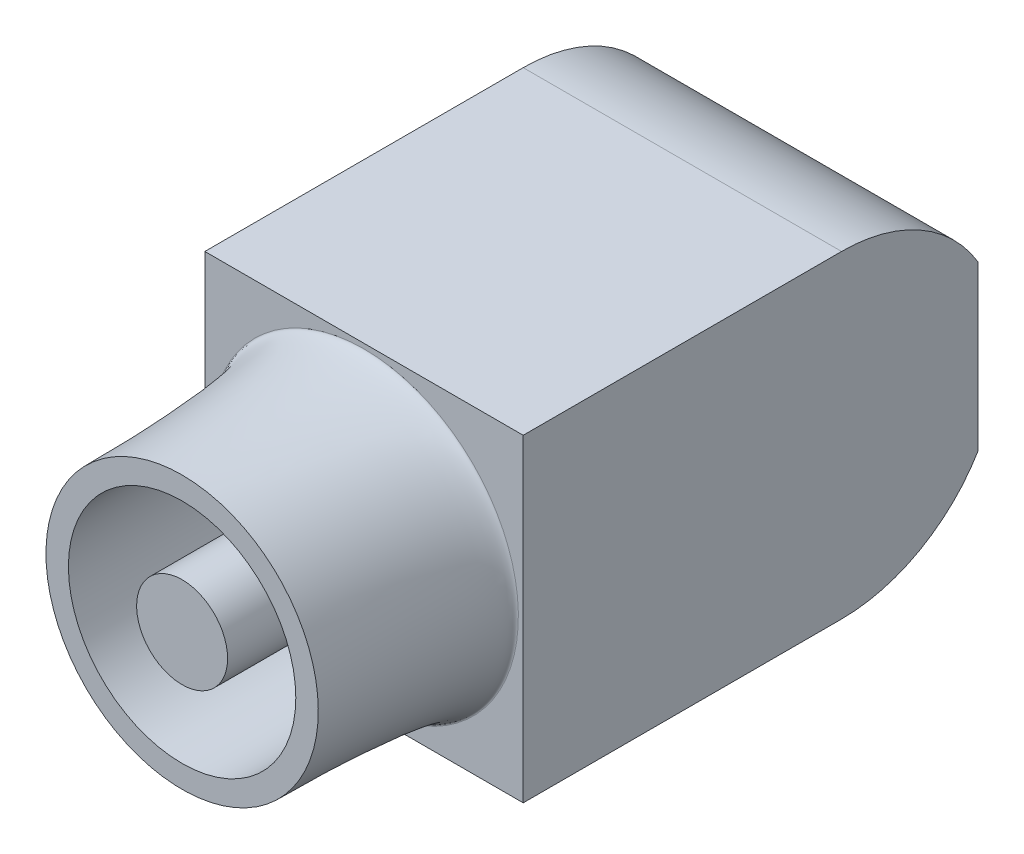
ISO-10303-21;
HEADER;
FILE_DESCRIPTION(('STEP AP214'),'2;1');
FILE_NAME('part.step','',(''),(''),'','','');
FILE_SCHEMA(('AUTOMOTIVE_DESIGN { 1 0 10303 214 1 1 1 1 }'));
ENDSEC;
DATA;
#1=APPLICATION_CONTEXT('core data for automotive mechanical design processes');
#2=APPLICATION_PROTOCOL_DEFINITION('international standard','automotive_design',2000,#1);
#3=PRODUCT_CONTEXT('',#1,'mechanical');
#4=PRODUCT('Part','Part','',(#3));
#5=PRODUCT_RELATED_PRODUCT_CATEGORY('part','',(#4));
#6=PRODUCT_DEFINITION_FORMATION('','',#4);
#7=PRODUCT_DEFINITION_CONTEXT('part definition',#1,'design');
#8=PRODUCT_DEFINITION('design','',#6,#7);
#9=PRODUCT_DEFINITION_SHAPE('','',#8);
#10=(LENGTH_UNIT() NAMED_UNIT(*) SI_UNIT(.MILLI.,.METRE.));
#11=(NAMED_UNIT(*) PLANE_ANGLE_UNIT() SI_UNIT($,.RADIAN.));
#12=(NAMED_UNIT(*) SI_UNIT($,.STERADIAN.) SOLID_ANGLE_UNIT());
#13=UNCERTAINTY_MEASURE_WITH_UNIT(LENGTH_MEASURE(1.E-05),#10,'distance_accuracy_value','');
#14=(GEOMETRIC_REPRESENTATION_CONTEXT(3) GLOBAL_UNCERTAINTY_ASSIGNED_CONTEXT((#13)) GLOBAL_UNIT_ASSIGNED_CONTEXT((#10,
#11,#12)) REPRESENTATION_CONTEXT('',''));
#15=CARTESIAN_POINT('',(0.,0.,0.));
#16=DIRECTION('',(0.,0.,1.));
#17=DIRECTION('',(1.,0.,0.));
#18=AXIS2_PLACEMENT_3D('',#15,#16,#17);
#19=CARTESIAN_POINT('',(35.,0.,-15.));
#20=DIRECTION('',(0.,0.,-1.));
#21=DIRECTION('',(0.,1.,0.));
#22=AXIS2_PLACEMENT_3D('',#19,#20,#21);
#23=PLANE('',#22);
#24=DIRECTION('',(0.,-1.,0.));
#25=VECTOR('',#24,1.);
#26=CARTESIAN_POINT('',(0.,0.,-15.));
#27=LINE('',#26,#25);
#28=CARTESIAN_POINT('',(0.,9.01387818865998,-15.));
#29=VERTEX_POINT('',#28);
#30=CARTESIAN_POINT('',(0.,-9.01387818865998,-15.));
#31=VERTEX_POINT('',#30);
#32=EDGE_CURVE('E147',#29,#31,#27,.T.);
#33=ORIENTED_EDGE('',*,*,#32,.F.);
#34=DIRECTION('',(-1.,0.,0.));
#35=VECTOR('',#34,1.);
#36=CARTESIAN_POINT('',(35.,9.01387818865998,-15.));
#37=LINE('',#36,#35);
#38=CARTESIAN_POINT('',(35.,9.01387818865998,-15.));
#39=VERTEX_POINT('',#38);
#40=EDGE_CURVE('E107',#39,#29,#37,.T.);
#41=ORIENTED_EDGE('',*,*,#40,.F.);
#42=DIRECTION('',(0.,-1.,0.));
#43=VECTOR('',#42,1.);
#44=CARTESIAN_POINT('',(35.,0.,-15.));
#45=LINE('',#44,#43);
#46=CARTESIAN_POINT('',(35.,-9.01387818865998,-15.));
#47=VERTEX_POINT('',#46);
#48=EDGE_CURVE('E218',#39,#47,#45,.T.);
#49=ORIENTED_EDGE('',*,*,#48,.T.);
#50=DIRECTION('',(-1.,0.,0.));
#51=VECTOR('',#50,1.);
#52=CARTESIAN_POINT('',(35.,-9.01387818865998,-15.));
#53=LINE('',#52,#51);
#54=EDGE_CURVE('E103',#47,#31,#53,.T.);
#55=ORIENTED_EDGE('',*,*,#54,.T.);
#56=EDGE_LOOP('',(#33,#41,#49,#55));
#57=FACE_BOUND('',#56,.T.);
#58=ADVANCED_FACE('F52',(#57),#23,.T.);
#59=CARTESIAN_POINT('',(35.,0.,0.));
#60=DIRECTION('',(-1.,0.,0.));
#61=DIRECTION('',(0.,0.,1.));
#62=AXIS2_PLACEMENT_3D('',#59,#60,#61);
#63=CYLINDRICAL_SURFACE('',#62,17.5);
#64=CARTESIAN_POINT('',(0.,0.,0.));
#65=DIRECTION('',(1.,0.,0.));
#66=DIRECTION('',(0.,0.,-1.));
#67=AXIS2_PLACEMENT_3D('',#64,#65,#66);
#68=CIRCLE('',#67,17.5);
#69=CARTESIAN_POINT('',(0.,17.5,0.));
#70=VERTEX_POINT('',#69);
#71=EDGE_CURVE('E151',#29,#70,#68,.T.);
#72=ORIENTED_EDGE('',*,*,#71,.T.);
#73=DIRECTION('',(-1.,0.,0.));
#74=VECTOR('',#73,1.);
#75=CARTESIAN_POINT('',(35.,17.5,0.));
#76=LINE('',#75,#74);
#77=CARTESIAN_POINT('',(35.,17.5,0.));
#78=VERTEX_POINT('',#77);
#79=EDGE_CURVE('E170',#78,#70,#76,.T.);
#80=ORIENTED_EDGE('',*,*,#79,.F.);
#81=CARTESIAN_POINT('',(35.,0.,0.));
#82=DIRECTION('',(1.,0.,0.));
#83=DIRECTION('',(0.,0.,-1.));
#84=AXIS2_PLACEMENT_3D('',#81,#82,#83);
#85=CIRCLE('',#84,17.5);
#86=EDGE_CURVE('E144',#39,#78,#85,.T.);
#87=ORIENTED_EDGE('',*,*,#86,.F.);
#88=ORIENTED_EDGE('',*,*,#40,.T.);
#89=EDGE_LOOP('',(#72,#80,#87,#88));
#90=FACE_BOUND('',#89,.T.);
#91=ADVANCED_FACE('F203',(#90),#63,.T.);
#92=CARTESIAN_POINT('',(35.,17.5,0.));
#93=DIRECTION('',(0.,-1.,0.));
#94=DIRECTION('',(0.,0.,-1.));
#95=AXIS2_PLACEMENT_3D('',#92,#93,#94);
#96=PLANE('',#95);
#97=DIRECTION('',(0.,0.,1.));
#98=VECTOR('',#97,1.);
#99=CARTESIAN_POINT('',(0.,17.5,0.));
#100=LINE('',#99,#98);
#101=CARTESIAN_POINT('',(0.,17.5,35.));
#102=VERTEX_POINT('',#101);
#103=EDGE_CURVE('E155',#70,#102,#100,.T.);
#104=ORIENTED_EDGE('',*,*,#103,.T.);
#105=DIRECTION('',(-1.,0.,0.));
#106=VECTOR('',#105,1.);
#107=CARTESIAN_POINT('',(35.,17.5,35.));
#108=LINE('',#107,#106);
#109=CARTESIAN_POINT('',(35.,17.5,35.));
#110=VERTEX_POINT('',#109);
#111=EDGE_CURVE('E137',#110,#102,#108,.T.);
#112=ORIENTED_EDGE('',*,*,#111,.F.);
#113=DIRECTION('',(0.,0.,1.));
#114=VECTOR('',#113,1.);
#115=CARTESIAN_POINT('',(35.,17.5,0.));
#116=LINE('',#115,#114);
#117=EDGE_CURVE('E122',#78,#110,#116,.T.);
#118=ORIENTED_EDGE('',*,*,#117,.F.);
#119=ORIENTED_EDGE('',*,*,#79,.T.);
#120=EDGE_LOOP('',(#104,#112,#118,#119));
#121=FACE_BOUND('',#120,.T.);
#122=ADVANCED_FACE('F199',(#121),#96,.F.);
#123=CARTESIAN_POINT('',(35.,0.,35.));
#124=DIRECTION('',(0.,0.,-1.));
#125=DIRECTION('',(0.,1.,0.));
#126=AXIS2_PLACEMENT_3D('',#123,#124,#125);
#127=PLANE('',#126);
#128=CARTESIAN_POINT('',(17.5,16.9699482682601,35.));
#129=CARTESIAN_POINT('',(16.3893194837355,16.9699482682601,35.));
#130=CARTESIAN_POINT('',(15.2786664293209,16.8605584902872,35.));
#131=CARTESIAN_POINT('',(13.0999882261753,16.4271924511403,35.));
#132=CARTESIAN_POINT('',(12.0320169457783,16.1032269050452,35.));
#133=CARTESIAN_POINT('',(9.97974695351019,15.2531488405964,35.));
#134=CARTESIAN_POINT('',(8.99549898452023,14.7270573406345,35.));
#135=CARTESIAN_POINT('',(7.14850478802411,13.4929352741744,35.));
#136=CARTESIAN_POINT('',(6.28580422791035,12.7849352216535,35.));
#137=CARTESIAN_POINT('',(4.71506477834649,11.2141957720897,35.));
#138=CARTESIAN_POINT('',(4.00706472582562,10.3514952119769,35.));
#139=CARTESIAN_POINT('',(2.77294265936551,8.50450101547881,35.));
#140=CARTESIAN_POINT('',(2.24685115940439,7.52025304649176,35.));
#141=CARTESIAN_POINT('',(1.39677309495398,5.46798305421979,35.));
#142=CARTESIAN_POINT('',(1.07280754886008,4.4000117738349,35.));
#143=CARTESIAN_POINT('',(0.639441509712423,2.22133357066886,35.));
#144=CARTESIAN_POINT('',(0.53005173173995,1.11068051625646,35.));
#145=CARTESIAN_POINT('',(0.53005173173995,-1.11068051625643,35.));
#146=CARTESIAN_POINT('',(0.639441509714357,-2.22133357067708,35.));
#147=CARTESIAN_POINT('',(1.07280754885816,-4.40001177382674,35.));
#148=CARTESIAN_POINT('',(1.39677309495785,-5.46798305422751,35.));
#149=CARTESIAN_POINT('',(2.24685115940054,-7.52025304648406,35.));
#150=CARTESIAN_POINT('',(2.77294265936572,-8.50450101548152,35.));
#151=CARTESIAN_POINT('',(4.00706472582543,-10.3514952119742,35.));
#152=CARTESIAN_POINT('',(4.71506477834892,-11.2141957720911,35.));
#153=CARTESIAN_POINT('',(6.28580422790789,-12.784935221652,35.));
#154=CARTESIAN_POINT('',(7.1485047880249,-13.4929352741755,35.));
#155=CARTESIAN_POINT('',(8.99549898451946,-14.7270573406333,35.));
#156=CARTESIAN_POINT('',(9.97974695351118,-15.2531488405953,35.));
#157=CARTESIAN_POINT('',(12.0320169457773,-16.1032269050463,35.));
#158=CARTESIAN_POINT('',(13.0999882261687,-16.4271924511407,35.));
#159=CARTESIAN_POINT('',(15.2786664293275,-16.8605584902868,35.));
#160=CARTESIAN_POINT('',(16.3893194837393,-16.96994826826,35.));
#161=CARTESIAN_POINT('',(18.6106805162606,-16.96994826826,35.));
#162=CARTESIAN_POINT('',(19.7213335706735,-16.8605584902887,35.));
#163=CARTESIAN_POINT('',(21.9000117738303,-16.4271924511388,35.));
#164=CARTESIAN_POINT('',(22.9679830542237,-16.1032269050444,35.));
#165=CARTESIAN_POINT('',(25.0202530464879,-15.2531488405972,35.));
#166=CARTESIAN_POINT('',(26.0045010154806,-14.7270573406343,35.));
#167=CARTESIAN_POINT('',(27.8514952119751,-13.4929352741746,35.));
#168=CARTESIAN_POINT('',(28.7141957720912,-12.784935221652,35.));
#169=CARTESIAN_POINT('',(30.2849352216521,-11.2141957720911,35.));
#170=CARTESIAN_POINT('',(30.9929352741775,-10.3514952119751,35.));
#171=CARTESIAN_POINT('',(32.2270573406314,-8.50450101548054,35.));
#172=CARTESIAN_POINT('',(32.7531488405934,-7.52025304648834,35.));
#173=CARTESIAN_POINT('',(33.6032269050483,-5.46798305422314,35.));
#174=CARTESIAN_POINT('',(33.9271924511427,-4.40001177383103,35.));
#175=CARTESIAN_POINT('',(34.3605584902848,-2.22133357067272,35.));
#176=CARTESIAN_POINT('',(34.4699482682601,-1.11068051626065,35.));
#177=CARTESIAN_POINT('',(34.4699482682601,1.11068051626061,35.));
#178=CARTESIAN_POINT('',(34.3605584902887,2.221333570673,35.));
#179=CARTESIAN_POINT('',(33.9271924511388,4.40001177383083,35.));
#180=CARTESIAN_POINT('',(33.6032269050444,5.46798305422368,35.));
#181=CARTESIAN_POINT('',(32.7531488405972,7.52025304648791,35.));
#182=CARTESIAN_POINT('',(32.2270573406314,8.50450101548057,35.));
#183=CARTESIAN_POINT('',(30.9929352741775,10.3514952119751,35.));
#184=CARTESIAN_POINT('',(30.284935221652,11.2141957720912,35.));
#185=CARTESIAN_POINT('',(28.7141957720911,12.7849352216521,35.));
#186=CARTESIAN_POINT('',(27.8514952119751,13.4929352741755,35.));
#187=CARTESIAN_POINT('',(26.0045010154805,14.7270573406333,35.));
#188=CARTESIAN_POINT('',(25.0202530464879,15.2531488405953,35.));
#189=CARTESIAN_POINT('',(22.9679830542236,16.1032269050464,35.));
#190=CARTESIAN_POINT('',(21.9000117738303,16.4271924511407,35.));
#191=CARTESIAN_POINT('',(19.7213335706734,16.8605584902868,35.));
#192=CARTESIAN_POINT('',(18.6106805162645,16.9699482682601,35.));
#193=CARTESIAN_POINT('',(17.5,16.9699482682601,35.));
#194=(BOUNDED_CURVE() B_SPLINE_CURVE(3,(#128,#129,#130,#131,#132,#133,#134,#135,#136,#137,#138,
#139,#140,#141,#142,#143,#144,#145,#146,#147,#148,#149,#150,#151,#152,#153,#154,#155,#156,#157,
#158,#159,#160,#161,#162,#163,#164,#165,#166,#167,#168,#169,#170,#171,#172,#173,#174,#175,#176,
#177,#178,#179,#180,#181,#182,#183,#184,#185,#186,#187,#188,#189,#190,#191,#192,#193),
.UNSPECIFIED.,.T.,.F.) B_SPLINE_CURVE_WITH_KNOTS((4,2,2,2,2,2,2,2,2,2,2,2,2,2,2,2,2,2,2,2,2,2,2,
2,2,2,2,2,2,2,2,2,4),(-6.28318530717959,-6.08683576633022,-5.89048622548086,-5.6941366846315,
-5.49778714378214,-5.30143760293278,-5.10508806208341,-4.90873852123405,-4.71238898038469,
-4.51603943953533,-4.31968989868597,-4.1233403578366,-3.92699081698724,-3.73064127613788,
-3.53429173528852,-3.33794219443916,-3.14159265358979,-2.94524311274043,-2.74889357189107,
-2.55254403104171,-2.35619449019234,-2.15984494934298,-1.96349540849362,-1.76714586764426,
-1.5707963267949,-1.37444678594553,-1.17809724509617,-0.981747704246811,-0.785398163397448,
-0.589048622548086,-0.392699081698725,-0.196349540849362,0.),
.UNSPECIFIED.) CURVE() GEOMETRIC_REPRESENTATION_ITEM() RATIONAL_B_SPLINE_CURVE((1.,1.,1.,1.,1.,
1.,1.,1.,1.,1.,1.,1.,1.,1.,1.,1.,1.,1.,1.,1.,1.,1.,1.,1.,1.,1.,1.,1.,1.,1.,1.,1.,1.,1.,1.,1.,1.,
1.,1.,1.,1.,1.,1.,1.,1.,1.,1.,1.,1.,1.,1.,1.,1.,1.,1.,1.,1.,1.,1.,1.,1.,1.,1.,1.,1.,1.)) REPRESENTATION_ITEM(''));
#195=CARTESIAN_POINT('',(17.5,16.9699482682601,35.));
#196=VERTEX_POINT('',#195);
#197=EDGE_CURVE('E66',#196,#196,#194,.F.);
#198=ORIENTED_EDGE('',*,*,#197,.T.);
#199=EDGE_LOOP('',(#198));
#200=FACE_BOUND('',#199,.T.);
#201=DIRECTION('',(0.,-1.,0.));
#202=VECTOR('',#201,1.);
#203=CARTESIAN_POINT('',(0.,0.,35.));
#204=LINE('',#203,#202);
#205=CARTESIAN_POINT('',(0.,-17.5,35.));
#206=VERTEX_POINT('',#205);
#207=EDGE_CURVE('E132',#102,#206,#204,.T.);
#208=ORIENTED_EDGE('',*,*,#207,.T.);
#209=DIRECTION('',(-1.,0.,0.));
#210=VECTOR('',#209,1.);
#211=CARTESIAN_POINT('',(35.,-17.5,35.));
#212=LINE('',#211,#210);
#213=CARTESIAN_POINT('',(35.,-17.5,35.));
#214=VERTEX_POINT('',#213);
#215=EDGE_CURVE('E129',#214,#206,#212,.T.);
#216=ORIENTED_EDGE('',*,*,#215,.F.);
#217=DIRECTION('',(0.,-1.,0.));
#218=VECTOR('',#217,1.);
#219=CARTESIAN_POINT('',(35.,0.,35.));
#220=LINE('',#219,#218);
#221=EDGE_CURVE('E116',#110,#214,#220,.T.);
#222=ORIENTED_EDGE('',*,*,#221,.F.);
#223=ORIENTED_EDGE('',*,*,#111,.T.);
#224=EDGE_LOOP('',(#208,#216,#222,#223));
#225=FACE_BOUND('',#224,.T.);
#226=ADVANCED_FACE('F130',(#200,#225),#127,.F.);
#227=CARTESIAN_POINT('',(35.,-17.5,0.));
#228=DIRECTION('',(0.,-1.,0.));
#229=DIRECTION('',(0.,0.,-1.));
#230=AXIS2_PLACEMENT_3D('',#227,#228,#229);
#231=PLANE('',#230);
#232=DIRECTION('',(0.,0.,1.));
#233=VECTOR('',#232,1.);
#234=CARTESIAN_POINT('',(0.,-17.5,0.));
#235=LINE('',#234,#233);
#236=CARTESIAN_POINT('',(0.,-17.5,0.));
#237=VERTEX_POINT('',#236);
#238=EDGE_CURVE('E161',#237,#206,#235,.T.);
#239=ORIENTED_EDGE('',*,*,#238,.F.);
#240=DIRECTION('',(-1.,0.,0.));
#241=VECTOR('',#240,1.);
#242=CARTESIAN_POINT('',(35.,-17.5,0.));
#243=LINE('',#242,#241);
#244=CARTESIAN_POINT('',(35.,-17.5,0.));
#245=VERTEX_POINT('',#244);
#246=EDGE_CURVE('E96',#245,#237,#243,.T.);
#247=ORIENTED_EDGE('',*,*,#246,.F.);
#248=DIRECTION('',(0.,0.,1.));
#249=VECTOR('',#248,1.);
#250=CARTESIAN_POINT('',(35.,-17.5,0.));
#251=LINE('',#250,#249);
#252=EDGE_CURVE('E120',#245,#214,#251,.T.);
#253=ORIENTED_EDGE('',*,*,#252,.T.);
#254=ORIENTED_EDGE('',*,*,#215,.T.);
#255=EDGE_LOOP('',(#239,#247,#253,#254));
#256=FACE_BOUND('',#255,.T.);
#257=ADVANCED_FACE('F139',(#256),#231,.T.);
#258=EDGE_CURVE('E156',#237,#31,#68,.T.);
#259=ORIENTED_EDGE('',*,*,#258,.T.);
#260=ORIENTED_EDGE('',*,*,#54,.F.);
#261=EDGE_CURVE('E74',#245,#47,#85,.T.);
#262=ORIENTED_EDGE('',*,*,#261,.F.);
#263=ORIENTED_EDGE('',*,*,#246,.T.);
#264=EDGE_LOOP('',(#259,#260,#262,#263));
#265=FACE_BOUND('',#264,.T.);
#266=ADVANCED_FACE('F210',(#265),#63,.T.);
#267=CARTESIAN_POINT('',(35.,0.,0.));
#268=DIRECTION('',(1.,0.,0.));
#269=DIRECTION('',(0.,0.,-1.));
#270=AXIS2_PLACEMENT_3D('',#267,#268,#269);
#271=PLANE('',#270);
#272=ORIENTED_EDGE('',*,*,#48,.F.);
#273=ORIENTED_EDGE('',*,*,#86,.T.);
#274=ORIENTED_EDGE('',*,*,#117,.T.);
#275=ORIENTED_EDGE('',*,*,#221,.T.);
#276=ORIENTED_EDGE('',*,*,#252,.F.);
#277=ORIENTED_EDGE('',*,*,#261,.T.);
#278=EDGE_LOOP('',(#272,#273,#274,#275,#276,#277));
#279=FACE_BOUND('',#278,.T.);
#280=ADVANCED_FACE('F118',(#279),#271,.T.);
#281=CARTESIAN_POINT('',(0.,0.,0.));
#282=DIRECTION('',(1.,0.,0.));
#283=DIRECTION('',(0.,0.,-1.));
#284=AXIS2_PLACEMENT_3D('',#281,#282,#283);
#285=PLANE('',#284);
#286=CARTESIAN_POINT('',(0.,0.,0.));
#287=DIRECTION('',(1.,0.,0.));
#288=DIRECTION('',(0.,0.,-1.));
#289=AXIS2_PLACEMENT_3D('',#286,#287,#288);
#290=CIRCLE('',#289,5.);
#291=CARTESIAN_POINT('',(0.,0.,-5.));
#292=VERTEX_POINT('',#291);
#293=EDGE_CURVE('E13',#292,#292,#290,.F.);
#294=ORIENTED_EDGE('',*,*,#293,.F.);
#295=EDGE_LOOP('',(#294));
#296=FACE_BOUND('',#295,.T.);
#297=ORIENTED_EDGE('',*,*,#32,.T.);
#298=ORIENTED_EDGE('',*,*,#258,.F.);
#299=ORIENTED_EDGE('',*,*,#238,.T.);
#300=ORIENTED_EDGE('',*,*,#207,.F.);
#301=ORIENTED_EDGE('',*,*,#103,.F.);
#302=ORIENTED_EDGE('',*,*,#71,.F.);
#303=EDGE_LOOP('',(#297,#298,#299,#300,#301,#302));
#304=FACE_BOUND('',#303,.T.);
#305=ADVANCED_FACE('F213',(#296,#304),#285,.F.);
#306=CARTESIAN_POINT('',(17.5,0.,55.));
#307=DIRECTION('',(0.,0.,-1.));
#308=DIRECTION('',(-1.,0.,0.));
#309=AXIS2_PLACEMENT_3D('',#306,#307,#308);
#310=CYLINDRICAL_SURFACE('',#309,12.5);
#311=CARTESIAN_POINT('',(17.5,0.,55.));
#312=DIRECTION('',(0.,0.,1.));
#313=DIRECTION('',(1.,0.,0.));
#314=AXIS2_PLACEMENT_3D('',#311,#312,#313);
#315=CIRCLE('',#314,12.5);
#316=CARTESIAN_POINT('',(30.,0.,55.));
#317=VERTEX_POINT('',#316);
#318=EDGE_CURVE('E226',#317,#317,#315,.T.);
#319=ORIENTED_EDGE('',*,*,#318,.T.);
#320=EDGE_LOOP('',(#319));
#321=FACE_BOUND('',#320,.T.);
#322=CARTESIAN_POINT('',(17.5,0.,35.));
#323=DIRECTION('',(0.,0.,1.));
#324=DIRECTION('',(1.,0.,0.));
#325=AXIS2_PLACEMENT_3D('',#322,#323,#324);
#326=CIRCLE('',#325,12.5);
#327=CARTESIAN_POINT('',(30.,0.,35.));
#328=VERTEX_POINT('',#327);
#329=EDGE_CURVE('E222',#328,#328,#326,.T.);
#330=ORIENTED_EDGE('',*,*,#329,.F.);
#331=EDGE_LOOP('',(#330));
#332=FACE_BOUND('',#331,.T.);
#333=ADVANCED_FACE('F248',(#321,#332),#310,.F.);
#334=CARTESIAN_POINT('',(0.,0.,55.));
#335=DIRECTION('',(0.,0.,1.));
#336=DIRECTION('',(1.,0.,0.));
#337=AXIS2_PLACEMENT_3D('',#334,#335,#336);
#338=PLANE('',#337);
#339=ORIENTED_EDGE('',*,*,#318,.F.);
#340=EDGE_LOOP('',(#339));
#341=FACE_BOUND('',#340,.T.);
#342=CARTESIAN_POINT('',(17.5,14.9699482682601,55.));
#343=CARTESIAN_POINT('',(18.4797808224416,14.9699482682601,55.));
#344=CARTESIAN_POINT('',(19.4595374195543,14.8734506660613,55.));
#345=CARTESIAN_POINT('',(21.3814466368849,14.4911591537533,55.));
#346=CARTESIAN_POINT('',(22.3235517374287,14.2053746958941,55.));
#347=CARTESIAN_POINT('',(24.1339506338225,13.4554829197025,55.));
#348=CARTESIAN_POINT('',(25.0021996671151,12.991394142629,55.));
#349=CARTESIAN_POINT('',(26.6315156282621,11.9027200229697,55.));
#350=CARTESIAN_POINT('',(27.3925422708754,11.2781615981216,55.));
#351=CARTESIAN_POINT('',(28.7781615981215,9.89254227087548,55.));
#352=CARTESIAN_POINT('',(29.4027200229704,9.13151562826103,55.));
#353=CARTESIAN_POINT('',(30.4913941426283,7.50219966711625,55.));
#354=CARTESIAN_POINT('',(30.9554829197023,6.63395063382285,55.));
#355=CARTESIAN_POINT('',(31.7053746958942,4.82355173742836,55.));
#356=CARTESIAN_POINT('',(31.9911591537528,3.88144663688753,55.));
#357=CARTESIAN_POINT('',(32.3734506660618,1.95953741955178,55.));
#358=CARTESIAN_POINT('',(32.4699482682601,0.979780822436787,55.));
#359=CARTESIAN_POINT('',(32.4699482682601,-0.979780822436837,55.));
#360=CARTESIAN_POINT('',(32.3734506660617,-1.95953741955248,55.));
#361=CARTESIAN_POINT('',(31.9911591537529,-3.88144663688676,55.));
#362=CARTESIAN_POINT('',(31.7053746958944,-4.82355173742791,55.));
#363=CARTESIAN_POINT('',(30.9554829197021,-6.63395063382322,55.));
#364=CARTESIAN_POINT('',(30.4913941426281,-7.50219966711646,55.));
#365=CARTESIAN_POINT('',(29.4027200229706,-9.13151562826079,55.));
#366=CARTESIAN_POINT('',(28.7781615981211,-9.8925422708759,55.));
#367=CARTESIAN_POINT('',(27.392542270876,-11.278161598121,55.));
#368=CARTESIAN_POINT('',(26.6315156282608,-11.9027200229705,55.));
#369=CARTESIAN_POINT('',(25.0021996671165,-12.9913941426281,55.));
#370=CARTESIAN_POINT('',(24.1339506338218,-13.4554829197027,55.));
#371=CARTESIAN_POINT('',(22.3235517374294,-14.2053746958938,55.));
#372=CARTESIAN_POINT('',(21.3814466368872,-14.4911591537528,55.));
#373=CARTESIAN_POINT('',(19.4595374195521,-14.8734506660617,55.));
#374=CARTESIAN_POINT('',(18.4797808224377,-14.9699482682601,55.));
#375=CARTESIAN_POINT('',(16.5202191775622,-14.9699482682601,55.));
#376=CARTESIAN_POINT('',(15.5404625804475,-14.8734506660617,55.));
#377=CARTESIAN_POINT('',(13.6185533631132,-14.4911591537529,55.));
#378=CARTESIAN_POINT('',(12.6764482625722,-14.2053746958944,55.));
#379=CARTESIAN_POINT('',(10.8660493661767,-13.4554829197021,55.));
#380=CARTESIAN_POINT('',(9.99780033288444,-12.9913941426287,55.));
#381=CARTESIAN_POINT('',(8.36848437173833,-11.90272002297,55.));
#382=CARTESIAN_POINT('',(7.6074577291231,-11.2781615981201,55.));
#383=CARTESIAN_POINT('',(6.22183840187989,-9.89254227087688,55.));
#384=CARTESIAN_POINT('',(5.59727997702946,-9.1315156282608,55.));
#385=CARTESIAN_POINT('',(4.50860585737187,-7.50219966711647,55.));
#386=CARTESIAN_POINT('',(4.04451708029582,-6.6339506338183,55.));
#387=CARTESIAN_POINT('',(3.29462530410771,-4.82355173743292,55.));
#388=CARTESIAN_POINT('',(3.00884084624633,-3.88144663688295,55.));
#389=CARTESIAN_POINT('',(2.6265493339391,-1.95953741955635,55.));
#390=CARTESIAN_POINT('',(2.53005173173995,-0.979780822433107,55.));
#391=CARTESIAN_POINT('',(2.53005173173995,0.979780822433131,55.));
#392=CARTESIAN_POINT('',(2.62654933393765,1.95953741954905,55.));
#393=CARTESIAN_POINT('',(3.00884084624777,3.8814466368902,55.));
#394=CARTESIAN_POINT('',(3.29462530410479,4.82355173742587,55.));
#395=CARTESIAN_POINT('',(4.04451708029872,6.63395063382531,55.));
#396=CARTESIAN_POINT('',(4.50860585737053,7.50219966711448,55.));
#397=CARTESIAN_POINT('',(5.59727997703077,9.13151562826277,55.));
#398=CARTESIAN_POINT('',(6.22183840187812,9.89254227087511,55.));
#399=CARTESIAN_POINT('',(7.60745772912491,11.2781615981219,55.));
#400=CARTESIAN_POINT('',(8.36848437173701,11.9027200229691,55.));
#401=CARTESIAN_POINT('',(9.99780033288574,12.9913941426296,55.));
#402=CARTESIAN_POINT('',(10.8660493661761,13.4554829197019,55.));
#403=CARTESIAN_POINT('',(12.6764482625727,14.2053746958946,55.));
#404=CARTESIAN_POINT('',(13.6185533631179,14.4911591537538,55.));
#405=CARTESIAN_POINT('',(15.5404625804428,14.8734506660607,55.));
#406=CARTESIAN_POINT('',(16.5202191775584,14.9699482682601,55.));
#407=CARTESIAN_POINT('',(17.5,14.9699482682601,55.));
#408=(BOUNDED_CURVE() B_SPLINE_CURVE(3,(#342,#343,#344,#345,#346,#347,#348,#349,#350,#351,#352,
#353,#354,#355,#356,#357,#358,#359,#360,#361,#362,#363,#364,#365,#366,#367,#368,#369,#370,#371,
#372,#373,#374,#375,#376,#377,#378,#379,#380,#381,#382,#383,#384,#385,#386,#387,#388,#389,#390,
#391,#392,#393,#394,#395,#396,#397,#398,#399,#400,#401,#402,#403,#404,#405,#406,#407),
.UNSPECIFIED.,.T.,.F.) B_SPLINE_CURVE_WITH_KNOTS((4,2,2,2,2,2,2,2,2,2,2,2,2,2,2,2,2,2,2,2,2,2,2,
2,2,2,2,2,2,2,2,2,4),(-6.28318530717959,-6.08683576633022,-5.89048622548086,-5.6941366846315,
-5.49778714378214,-5.30143760293278,-5.10508806208341,-4.90873852123405,-4.71238898038469,
-4.51603943953533,-4.31968989868597,-4.1233403578366,-3.92699081698724,-3.73064127613788,
-3.53429173528852,-3.33794219443916,-3.14159265358979,-2.94524311274043,-2.74889357189107,
-2.55254403104171,-2.35619449019234,-2.15984494934298,-1.96349540849362,-1.76714586764426,
-1.5707963267949,-1.37444678594553,-1.17809724509617,-0.98174770424681,-0.785398163397448,
-0.589048622548086,-0.392699081698724,-0.196349540849362,0.),
.UNSPECIFIED.) CURVE() GEOMETRIC_REPRESENTATION_ITEM() RATIONAL_B_SPLINE_CURVE((1.,1.,1.,1.,1.,
1.,1.,1.,1.,1.,1.,1.,1.,1.,1.,1.,1.,1.,1.,1.,1.,1.,1.,1.,1.,1.,1.,1.,1.,1.,1.,1.,1.,1.,1.,1.,1.,
1.,1.,1.,1.,1.,1.,1.,1.,1.,1.,1.,1.,1.,1.,1.,1.,1.,1.,1.,1.,1.,1.,1.,1.,1.,1.,1.,1.,1.)) REPRESENTATION_ITEM(''));
#409=CARTESIAN_POINT('',(17.5,14.9699482682601,55.));
#410=VERTEX_POINT('',#409);
#411=EDGE_CURVE('E152',#410,#410,#408,.F.);
#412=ORIENTED_EDGE('',*,*,#411,.T.);
#413=EDGE_LOOP('',(#412));
#414=FACE_BOUND('',#413,.T.);
#415=ADVANCED_FACE('F255',(#341,#414),#338,.T.);
#416=CARTESIAN_POINT('',(17.5,0.,35.));
#417=DIRECTION('',(0.,0.,-1.));
#418=DIRECTION('',(0.,1.,0.));
#419=AXIS2_PLACEMENT_3D('',#416,#417,#418);
#420=CIRCLE('',#419,5.);
#421=CARTESIAN_POINT('',(17.5,5.,35.));
#422=VERTEX_POINT('',#421);
#423=EDGE_CURVE('E176',#422,#422,#420,.F.);
#424=ORIENTED_EDGE('',*,*,#423,.F.);
#425=EDGE_LOOP('',(#424));
#426=FACE_BOUND('',#425,.T.);
#427=ORIENTED_EDGE('',*,*,#329,.T.);
#428=EDGE_LOOP('',(#427));
#429=FACE_BOUND('',#428,.T.);
#430=ADVANCED_FACE('F200',(#426,#429),#127,.F.);
#431=CARTESIAN_POINT('',(17.5,0.,55.));
#432=DIRECTION('',(0.,0.,-1.));
#433=DIRECTION('',(-1.,0.,0.));
#434=AXIS2_PLACEMENT_3D('',#431,#432,#433);
#435=CYLINDRICAL_SURFACE('',#434,5.);
#436=CARTESIAN_POINT('',(17.5,0.,55.));
#437=DIRECTION('',(0.,0.,1.));
#438=DIRECTION('',(1.,0.,0.));
#439=AXIS2_PLACEMENT_3D('',#436,#437,#438);
#440=CIRCLE('',#439,5.);
#441=CARTESIAN_POINT('',(22.5,0.,55.));
#442=VERTEX_POINT('',#441);
#443=EDGE_CURVE('E227',#442,#442,#440,.T.);
#444=ORIENTED_EDGE('',*,*,#443,.F.);
#445=EDGE_LOOP('',(#444));
#446=FACE_BOUND('',#445,.T.);
#447=ORIENTED_EDGE('',*,*,#423,.T.);
#448=EDGE_LOOP('',(#447));
#449=FACE_BOUND('',#448,.T.);
#450=ADVANCED_FACE('F286',(#446,#449),#435,.T.);
#451=CARTESIAN_POINT('',(0.,0.,55.));
#452=DIRECTION('',(0.,0.,1.));
#453=DIRECTION('',(1.,0.,0.));
#454=AXIS2_PLACEMENT_3D('',#451,#452,#453);
#455=PLANE('',#454);
#456=ORIENTED_EDGE('',*,*,#443,.T.);
#457=EDGE_LOOP('',(#456));
#458=FACE_BOUND('',#457,.T.);
#459=ADVANCED_FACE('F289',(#458),#455,.T.);
#460=CARTESIAN_POINT('',(17.5,16.9699482682601,35.));
#461=CARTESIAN_POINT('',(18.6106805162645,16.9699482682601,35.));
#462=CARTESIAN_POINT('',(19.7213335706734,16.8605584902868,35.));
#463=CARTESIAN_POINT('',(21.9000117738303,16.4271924511407,35.));
#464=CARTESIAN_POINT('',(22.9679830542236,16.1032269050464,35.));
#465=CARTESIAN_POINT('',(25.0202530464879,15.2531488405953,35.));
#466=CARTESIAN_POINT('',(26.0045010154805,14.7270573406333,35.));
#467=CARTESIAN_POINT('',(27.8514952119751,13.4929352741755,35.));
#468=CARTESIAN_POINT('',(28.7141957720911,12.7849352216521,35.));
#469=CARTESIAN_POINT('',(30.284935221652,11.2141957720912,35.));
#470=CARTESIAN_POINT('',(30.9929352741775,10.3514952119751,35.));
#471=CARTESIAN_POINT('',(32.2270573406314,8.50450101548057,35.));
#472=CARTESIAN_POINT('',(32.7531488405972,7.52025304648791,35.));
#473=CARTESIAN_POINT('',(33.6032269050444,5.46798305422368,35.));
#474=CARTESIAN_POINT('',(33.9271924511388,4.40001177383083,35.));
#475=CARTESIAN_POINT('',(34.3605584902887,2.221333570673,35.));
#476=CARTESIAN_POINT('',(34.4699482682601,1.11068051626061,35.));
#477=CARTESIAN_POINT('',(34.4699482682601,-1.11068051626065,35.));
#478=CARTESIAN_POINT('',(34.3605584902848,-2.22133357067272,35.));
#479=CARTESIAN_POINT('',(33.9271924511427,-4.40001177383103,35.));
#480=CARTESIAN_POINT('',(33.6032269050483,-5.46798305422314,35.));
#481=CARTESIAN_POINT('',(32.7531488405934,-7.52025304648834,35.));
#482=CARTESIAN_POINT('',(32.2270573406314,-8.50450101548054,35.));
#483=CARTESIAN_POINT('',(30.9929352741775,-10.3514952119751,35.));
#484=CARTESIAN_POINT('',(30.2849352216521,-11.2141957720911,35.));
#485=CARTESIAN_POINT('',(28.7141957720912,-12.784935221652,35.));
#486=CARTESIAN_POINT('',(27.8514952119751,-13.4929352741746,35.));
#487=CARTESIAN_POINT('',(26.0045010154806,-14.7270573406343,35.));
#488=CARTESIAN_POINT('',(25.0202530464879,-15.2531488405972,35.));
#489=CARTESIAN_POINT('',(22.9679830542237,-16.1032269050444,35.));
#490=CARTESIAN_POINT('',(21.9000117738303,-16.4271924511388,35.));
#491=CARTESIAN_POINT('',(19.7213335706735,-16.8605584902887,35.));
#492=CARTESIAN_POINT('',(18.6106805162606,-16.96994826826,35.));
#493=CARTESIAN_POINT('',(16.3893194837393,-16.96994826826,35.));
#494=CARTESIAN_POINT('',(15.2786664293275,-16.8605584902868,35.));
#495=CARTESIAN_POINT('',(13.0999882261687,-16.4271924511407,35.));
#496=CARTESIAN_POINT('',(12.0320169457773,-16.1032269050463,35.));
#497=CARTESIAN_POINT('',(9.97974695351118,-15.2531488405953,35.));
#498=CARTESIAN_POINT('',(8.99549898451946,-14.7270573406333,35.));
#499=CARTESIAN_POINT('',(7.1485047880249,-13.4929352741755,35.));
#500=CARTESIAN_POINT('',(6.28580422790789,-12.784935221652,35.));
#501=CARTESIAN_POINT('',(4.71506477834892,-11.2141957720911,35.));
#502=CARTESIAN_POINT('',(4.00706472582543,-10.3514952119742,35.));
#503=CARTESIAN_POINT('',(2.77294265936572,-8.50450101548152,35.));
#504=CARTESIAN_POINT('',(2.24685115940054,-7.52025304648406,35.));
#505=CARTESIAN_POINT('',(1.39677309495785,-5.46798305422751,35.));
#506=CARTESIAN_POINT('',(1.07280754885816,-4.40001177382674,35.));
#507=CARTESIAN_POINT('',(0.639441509714357,-2.22133357067708,35.));
#508=CARTESIAN_POINT('',(0.53005173173995,-1.11068051625643,35.));
#509=CARTESIAN_POINT('',(0.53005173173995,1.11068051625646,35.));
#510=CARTESIAN_POINT('',(0.639441509712423,2.22133357066886,35.));
#511=CARTESIAN_POINT('',(1.07280754886008,4.4000117738349,35.));
#512=CARTESIAN_POINT('',(1.39677309495398,5.46798305421979,35.));
#513=CARTESIAN_POINT('',(2.24685115940439,7.52025304649176,35.));
#514=CARTESIAN_POINT('',(2.77294265936551,8.50450101547881,35.));
#515=CARTESIAN_POINT('',(4.00706472582562,10.3514952119769,35.));
#516=CARTESIAN_POINT('',(4.71506477834649,11.2141957720897,35.));
#517=CARTESIAN_POINT('',(6.28580422791035,12.7849352216535,35.));
#518=CARTESIAN_POINT('',(7.14850478802411,13.4929352741744,35.));
#519=CARTESIAN_POINT('',(8.99549898452023,14.7270573406345,35.));
#520=CARTESIAN_POINT('',(9.97974695351019,15.2531488405964,35.));
#521=CARTESIAN_POINT('',(12.0320169457783,16.1032269050452,35.));
#522=CARTESIAN_POINT('',(13.0999882261753,16.4271924511403,35.));
#523=CARTESIAN_POINT('',(15.2786664293209,16.8605584902872,35.));
#524=CARTESIAN_POINT('',(16.3893194837355,16.9699482682601,35.));
#525=CARTESIAN_POINT('',(17.5,16.9699482682601,35.));
#526=CARTESIAN_POINT('',(17.5,14.9699482682601,35.));
#527=CARTESIAN_POINT('',(18.4797808224416,14.9699482682601,35.));
#528=CARTESIAN_POINT('',(19.4595374195542,14.8734506660605,35.));
#529=CARTESIAN_POINT('',(21.3814466368851,14.4911591537542,35.));
#530=CARTESIAN_POINT('',(22.3235517374292,14.2053746958953,35.));
#531=CARTESIAN_POINT('',(24.133950633822,13.4554829197013,35.));
#532=CARTESIAN_POINT('',(25.0021996671151,12.991394142629,34.9999999999961));
#533=CARTESIAN_POINT('',(26.6315156282623,11.9027200229699,35.0000000000039));
#534=CARTESIAN_POINT('',(27.3925422708755,11.2781615981226,34.9999999999961));
#535=CARTESIAN_POINT('',(28.7781615981216,9.89254227087456,35.0000000000039));
#536=CARTESIAN_POINT('',(29.4027200229708,9.13151562826131,34.9999999999961));
#537=CARTESIAN_POINT('',(30.491394142628,7.50219966711605,35.0000000000039));
#538=CARTESIAN_POINT('',(30.9554829197003,6.63395063382155,35.));
#539=CARTESIAN_POINT('',(31.7053746958963,4.82355173742972,35.));
#540=CARTESIAN_POINT('',(31.9911591537504,3.88144663688706,35.0000000000039));
#541=CARTESIAN_POINT('',(32.3734506660643,1.95953741955228,34.9999999999961));
#542=CARTESIAN_POINT('',(32.4699482682601,0.979780822436796,34.9999999999961));
#543=CARTESIAN_POINT('',(32.4699482682601,-0.979780822436837,35.0000000000039));
#544=CARTESIAN_POINT('',(32.3734506660605,-1.959537419552,35.));
#545=CARTESIAN_POINT('',(31.9911591537542,-3.88144663688726,35.));
#546=CARTESIAN_POINT('',(31.7053746958925,-4.82355173742919,35.));
#547=CARTESIAN_POINT('',(30.9554829197042,-6.63395063382199,35.));
#548=CARTESIAN_POINT('',(30.4913941426261,-7.50219966711507,35.));
#549=CARTESIAN_POINT('',(29.4027200229727,-9.13151562826225,35.));
#550=CARTESIAN_POINT('',(28.7781615981216,-9.89254227087643,35.));
#551=CARTESIAN_POINT('',(27.3925422708755,-11.2781615981206,35.));
#552=CARTESIAN_POINT('',(26.6315156282603,-11.9027200229698,35.));
#553=CARTESIAN_POINT('',(25.002199667117,-12.9913941426289,35.));
#554=CARTESIAN_POINT('',(24.133950633824,-13.4554829197032,35.));
#555=CARTESIAN_POINT('',(22.3235517374273,-14.2053746958934,35.));
#556=CARTESIAN_POINT('',(21.381446636887,-14.4911591537523,35.));
#557=CARTESIAN_POINT('',(19.4595374195523,-14.8734506660624,35.));
#558=CARTESIAN_POINT('',(18.4797808224377,-14.9699482682601,35.));
#559=CARTESIAN_POINT('',(16.5202191775622,-14.9699482682601,35.));
#560=CARTESIAN_POINT('',(15.5404625804487,-14.8734506660605,35.));
#561=CARTESIAN_POINT('',(13.618553363112,-14.4911591537542,35.));
#562=CARTESIAN_POINT('',(12.6764482625718,-14.2053746958953,35.));
#563=CARTESIAN_POINT('',(10.866049366177,-13.4554829197013,35.));
#564=CARTESIAN_POINT('',(9.99780033288493,-12.991394142628,35.));
#565=CARTESIAN_POINT('',(8.36848437173775,-11.9027200229708,35.));
#566=CARTESIAN_POINT('',(7.60745772912354,-11.2781615981206,35.));
#567=CARTESIAN_POINT('',(6.22183840187936,-9.89254227087645,35.));
#568=CARTESIAN_POINT('',(5.59727997703015,-9.13151562826034,34.9999999999961));
#569=CARTESIAN_POINT('',(4.50860585737106,-7.50219966711701,35.0000000000039));
#570=CARTESIAN_POINT('',(4.04451708029508,-6.6339506338187,35.));
#571=CARTESIAN_POINT('',(3.29462530410832,-4.82355173743256,35.));
#572=CARTESIAN_POINT('',(3.00884084624504,-3.88144663688345,35.));
#573=CARTESIAN_POINT('',(2.62654933394025,-1.95953741955588,35.));
#574=CARTESIAN_POINT('',(2.53005173173988,-0.979780822433108,35.));
#575=CARTESIAN_POINT('',(2.53005173173988,0.979780822433139,35.));
#576=CARTESIAN_POINT('',(2.62654933393856,1.95953741954887,34.9999999999961));
#577=CARTESIAN_POINT('',(3.00884084624672,3.88144663689041,35.0000000000039));
#578=CARTESIAN_POINT('',(3.29462530410471,4.82355173742581,35.));
#579=CARTESIAN_POINT('',(4.04451708029868,6.63395063382543,35.));
#580=CARTESIAN_POINT('',(4.50860585737051,7.5021996671145,35.));
#581=CARTESIAN_POINT('',(5.59727997703069,9.13151562826283,35.));
#582=CARTESIAN_POINT('',(6.22183840187855,9.89254227087613,35.));
#583=CARTESIAN_POINT('',(7.60745772912438,11.278161598121,35.));
#584=CARTESIAN_POINT('',(8.36848437173814,11.9027200229688,35.));
#585=CARTESIAN_POINT('',(9.99780033288454,12.99139414263,35.));
#586=CARTESIAN_POINT('',(10.8660493661763,13.4554829197015,35.));
#587=CARTESIAN_POINT('',(12.6764482625725,14.2053746958951,35.));
#588=CARTESIAN_POINT('',(13.6185533631179,14.4911591537539,35.));
#589=CARTESIAN_POINT('',(15.5404625804428,14.8734506660608,35.));
#590=CARTESIAN_POINT('',(16.5202191775584,14.9699482682601,35.));
#591=CARTESIAN_POINT('',(17.5,14.9699482682601,35.));
#592=CARTESIAN_POINT('',(17.5,14.9699482682601,55.));
#593=CARTESIAN_POINT('',(18.4797808224416,14.9699482682601,55.));
#594=CARTESIAN_POINT('',(19.4595374195543,14.8734506660613,55.));
#595=CARTESIAN_POINT('',(21.3814466368849,14.4911591537533,55.));
#596=CARTESIAN_POINT('',(22.3235517374287,14.2053746958941,55.));
#597=CARTESIAN_POINT('',(24.1339506338225,13.4554829197025,55.));
#598=CARTESIAN_POINT('',(25.0021996671151,12.991394142629,55.));
#599=CARTESIAN_POINT('',(26.6315156282621,11.9027200229697,55.));
#600=CARTESIAN_POINT('',(27.3925422708754,11.2781615981216,55.));
#601=CARTESIAN_POINT('',(28.7781615981215,9.89254227087548,55.));
#602=CARTESIAN_POINT('',(29.4027200229704,9.13151562826103,55.));
#603=CARTESIAN_POINT('',(30.4913941426283,7.50219966711625,55.));
#604=CARTESIAN_POINT('',(30.9554829197023,6.63395063382285,55.));
#605=CARTESIAN_POINT('',(31.7053746958942,4.82355173742836,55.));
#606=CARTESIAN_POINT('',(31.9911591537528,3.88144663688753,55.));
#607=CARTESIAN_POINT('',(32.3734506660618,1.95953741955178,55.));
#608=CARTESIAN_POINT('',(32.4699482682601,0.979780822436787,55.));
#609=CARTESIAN_POINT('',(32.4699482682601,-0.979780822436837,55.));
#610=CARTESIAN_POINT('',(32.3734506660617,-1.95953741955248,55.));
#611=CARTESIAN_POINT('',(31.9911591537529,-3.88144663688676,55.));
#612=CARTESIAN_POINT('',(31.7053746958944,-4.82355173742791,55.));
#613=CARTESIAN_POINT('',(30.9554829197021,-6.63395063382322,55.));
#614=CARTESIAN_POINT('',(30.4913941426281,-7.50219966711646,55.));
#615=CARTESIAN_POINT('',(29.4027200229706,-9.13151562826079,55.));
#616=CARTESIAN_POINT('',(28.7781615981211,-9.8925422708759,55.));
#617=CARTESIAN_POINT('',(27.392542270876,-11.278161598121,55.));
#618=CARTESIAN_POINT('',(26.6315156282608,-11.9027200229705,55.));
#619=CARTESIAN_POINT('',(25.0021996671165,-12.9913941426281,55.));
#620=CARTESIAN_POINT('',(24.1339506338218,-13.4554829197027,55.));
#621=CARTESIAN_POINT('',(22.3235517374294,-14.2053746958938,55.));
#622=CARTESIAN_POINT('',(21.3814466368872,-14.4911591537528,55.));
#623=CARTESIAN_POINT('',(19.4595374195521,-14.8734506660617,55.));
#624=CARTESIAN_POINT('',(18.4797808224377,-14.9699482682601,55.));
#625=CARTESIAN_POINT('',(16.5202191775622,-14.9699482682601,55.));
#626=CARTESIAN_POINT('',(15.5404625804475,-14.8734506660617,55.));
#627=CARTESIAN_POINT('',(13.6185533631132,-14.4911591537529,55.));
#628=CARTESIAN_POINT('',(12.6764482625722,-14.2053746958944,55.));
#629=CARTESIAN_POINT('',(10.8660493661767,-13.4554829197021,55.));
#630=CARTESIAN_POINT('',(9.99780033288444,-12.9913941426287,55.));
#631=CARTESIAN_POINT('',(8.36848437173833,-11.90272002297,55.));
#632=CARTESIAN_POINT('',(7.6074577291231,-11.2781615981201,55.));
#633=CARTESIAN_POINT('',(6.22183840187989,-9.89254227087688,55.));
#634=CARTESIAN_POINT('',(5.59727997702946,-9.1315156282608,55.));
#635=CARTESIAN_POINT('',(4.50860585737187,-7.50219966711647,55.));
#636=CARTESIAN_POINT('',(4.04451708029582,-6.6339506338183,55.));
#637=CARTESIAN_POINT('',(3.29462530410771,-4.82355173743292,55.));
#638=CARTESIAN_POINT('',(3.00884084624633,-3.88144663688295,55.));
#639=CARTESIAN_POINT('',(2.6265493339391,-1.95953741955635,55.));
#640=CARTESIAN_POINT('',(2.53005173173995,-0.979780822433107,55.));
#641=CARTESIAN_POINT('',(2.53005173173995,0.979780822433131,55.));
#642=CARTESIAN_POINT('',(2.62654933393765,1.95953741954905,55.));
#643=CARTESIAN_POINT('',(3.00884084624777,3.8814466368902,55.));
#644=CARTESIAN_POINT('',(3.29462530410479,4.82355173742587,55.));
#645=CARTESIAN_POINT('',(4.04451708029872,6.63395063382531,55.));
#646=CARTESIAN_POINT('',(4.50860585737053,7.50219966711448,55.));
#647=CARTESIAN_POINT('',(5.59727997703077,9.13151562826277,55.));
#648=CARTESIAN_POINT('',(6.22183840187812,9.89254227087511,55.));
#649=CARTESIAN_POINT('',(7.60745772912491,11.2781615981219,55.));
#650=CARTESIAN_POINT('',(8.36848437173701,11.9027200229691,55.));
#651=CARTESIAN_POINT('',(9.99780033288574,12.9913941426296,55.));
#652=CARTESIAN_POINT('',(10.8660493661761,13.4554829197019,55.));
#653=CARTESIAN_POINT('',(12.6764482625727,14.2053746958946,55.));
#654=CARTESIAN_POINT('',(13.6185533631179,14.4911591537538,55.));
#655=CARTESIAN_POINT('',(15.5404625804428,14.8734506660607,55.));
#656=CARTESIAN_POINT('',(16.5202191775584,14.9699482682601,55.));
#657=CARTESIAN_POINT('',(17.5,14.9699482682601,55.));
#658=(BOUNDED_SURFACE() B_SPLINE_SURFACE(2,3,((#460,#461,#462,#463,#464,#465,#466,#467,#468,
#469,#470,#471,#472,#473,#474,#475,#476,#477,#478,#479,#480,#481,#482,#483,#484,#485,#486,#487,
#488,#489,#490,#491,#492,#493,#494,#495,#496,#497,#498,#499,#500,#501,#502,#503,#504,#505,#506,
#507,#508,#509,#510,#511,#512,#513,#514,#515,#516,#517,#518,#519,#520,#521,#522,#523,#524,#525),
(#526,#527,#528,#529,#530,#531,#532,#533,#534,#535,#536,#537,#538,#539,#540,#541,#542,#543,#544,
#545,#546,#547,#548,#549,#550,#551,#552,#553,#554,#555,#556,#557,#558,#559,#560,#561,#562,#563,
#564,#565,#566,#567,#568,#569,#570,#571,#572,#573,#574,#575,#576,#577,#578,#579,#580,#581,#582,
#583,#584,#585,#586,#587,#588,#589,#590,#591),(#592,#593,#594,#595,#596,#597,#598,#599,#600,
#601,#602,#603,#604,#605,#606,#607,#608,#609,#610,#611,#612,#613,#614,#615,#616,#617,#618,#619,
#620,#621,#622,#623,#624,#625,#626,#627,#628,#629,#630,#631,#632,#633,#634,#635,#636,#637,#638,
#639,#640,#641,#642,#643,#644,#645,#646,#647,#648,#649,#650,#651,#652,#653,#654,#655,#656,
#657)),.UNSPECIFIED.,.F.,.T.,.F.) B_SPLINE_SURFACE_WITH_KNOTS((3,3),(4,2,2,2,2,2,2,2,2,2,2,2,2,
2,2,2,2,2,2,2,2,2,2,2,2,2,2,2,2,2,2,2,4),(0.,1.),(-6.28318530717959,-6.08683576633022,
-5.89048622548086,-5.6941366846315,-5.49778714378214,-5.30143760293278,-5.10508806208341,
-4.90873852123405,-4.71238898038469,-4.51603943953533,-4.31968989868597,-4.1233403578366,
-3.92699081698724,-3.73064127613788,-3.53429173528852,-3.33794219443916,-3.14159265358979,
-2.94524311274043,-2.74889357189107,-2.55254403104171,-2.35619449019234,-2.15984494934298,
-1.96349540849362,-1.76714586764426,-1.5707963267949,-1.37444678594553,-1.17809724509617,
-0.98174770424681,-0.785398163397448,-0.589048622548086,-0.392699081698724,-0.196349540849362,
0.),.UNSPECIFIED.) GEOMETRIC_REPRESENTATION_ITEM() RATIONAL_B_SPLINE_SURFACE(((1.,1.,1.,1.,1.,
1.,1.,1.,1.,1.,1.,1.,1.,1.,1.,1.,1.,1.,1.,1.,1.,1.,1.,1.,1.,1.,1.,1.,1.,1.,1.,1.,1.,1.,1.,1.,1.,
1.,1.,1.,1.,1.,1.,1.,1.,1.,1.,1.,1.,1.,1.,1.,1.,1.,1.,1.,1.,1.,1.,1.,1.,1.,1.,1.,1.,1.),
(0.707106781186549,0.707106781186549,0.707106781186549,0.707106781186549,0.707106781186549,
0.707106781186549,0.707106781186549,0.707106781186549,0.707106781186549,0.707106781186549,
0.707106781186549,0.707106781186549,0.707106781186549,0.707106781186549,0.707106781186549,
0.707106781186549,0.707106781186549,0.707106781186549,0.707106781186549,0.707106781186549,
0.707106781186549,0.707106781186549,0.707106781186549,0.707106781186549,0.707106781186549,
0.707106781186549,0.707106781186549,0.707106781186549,0.707106781186549,0.707106781186549,
0.707106781186549,0.707106781186549,0.707106781186549,0.707106781186549,0.707106781186549,
0.707106781186549,0.707106781186549,0.707106781186549,0.707106781186549,0.707106781186549,
0.707106781186549,0.707106781186549,0.707106781186549,0.707106781186549,0.707106781186549,
0.707106781186549,0.707106781186549,0.707106781186549,0.707106781186549,0.707106781186549,
0.707106781186549,0.707106781186549,0.707106781186549,0.707106781186549,0.707106781186549,
0.707106781186549,0.707106781186549,0.707106781186549,0.707106781186549,0.707106781186549,
0.707106781186549,0.707106781186549,0.707106781186549,0.707106781186549,0.707106781186549,
0.707106781186549),(1.,1.,1.,1.,1.,1.,1.,1.,1.,1.,1.,1.,1.,1.,1.,1.,1.,1.,1.,1.,1.,1.,1.,1.,1.,
1.,1.,1.,1.,1.,1.,1.,1.,1.,1.,1.,1.,1.,1.,1.,1.,1.,1.,1.,1.,1.,1.,1.,1.,1.,1.,1.,1.,1.,1.,1.,1.,
1.,1.,1.,1.,1.,1.,1.,1.,1.))) REPRESENTATION_ITEM('') SURFACE());
#659=ORIENTED_EDGE('',*,*,#197,.F.);
#660=EDGE_LOOP('',(#659));
#661=FACE_BOUND('',#660,.T.);
#662=ORIENTED_EDGE('',*,*,#411,.F.);
#663=EDGE_LOOP('',(#662));
#664=FACE_BOUND('',#663,.T.);
#665=ADVANCED_FACE('F55',(#661,#664),#658,.T.);
#666=CARTESIAN_POINT('',(-2.,0.,0.));
#667=DIRECTION('',(1.,0.,0.));
#668=DIRECTION('',(0.,0.,-1.));
#669=AXIS2_PLACEMENT_3D('',#666,#667,#668);
#670=CYLINDRICAL_SURFACE('',#669,5.);
#671=CARTESIAN_POINT('',(-2.,0.,0.));
#672=DIRECTION('',(-1.,0.,0.));
#673=DIRECTION('',(0.,0.,1.));
#674=AXIS2_PLACEMENT_3D('',#671,#672,#673);
#675=CIRCLE('',#674,5.);
#676=CARTESIAN_POINT('',(-2.,0.,5.));
#677=VERTEX_POINT('',#676);
#678=EDGE_CURVE('E234',#677,#677,#675,.T.);
#679=ORIENTED_EDGE('',*,*,#678,.F.);
#680=EDGE_LOOP('',(#679));
#681=FACE_BOUND('',#680,.T.);
#682=ORIENTED_EDGE('',*,*,#293,.T.);
#683=EDGE_LOOP('',(#682));
#684=FACE_BOUND('',#683,.T.);
#685=ADVANCED_FACE('F241',(#681,#684),#670,.T.);
#686=CARTESIAN_POINT('',(-2.,0.,0.));
#687=DIRECTION('',(-1.,0.,0.));
#688=DIRECTION('',(0.,0.,1.));
#689=AXIS2_PLACEMENT_3D('',#686,#687,#688);
#690=PLANE('',#689);
#691=ORIENTED_EDGE('',*,*,#678,.T.);
#692=EDGE_LOOP('',(#691));
#693=FACE_BOUND('',#692,.T.);
#694=ADVANCED_FACE('F239',(#693),#690,.T.);
#695=CLOSED_SHELL('',(#58,#91,#122,#226,#257,#266,#280,#305,#333,#415,#430,#450,#459,#665,#685,#694));
#696=MANIFOLD_SOLID_BREP('B2',#695);
#697=ADVANCED_BREP_SHAPE_REPRESENTATION('',(#18,#696),#14);
#698=SHAPE_DEFINITION_REPRESENTATION(#9,#697);
ENDSEC;
END-ISO-10303-21;
